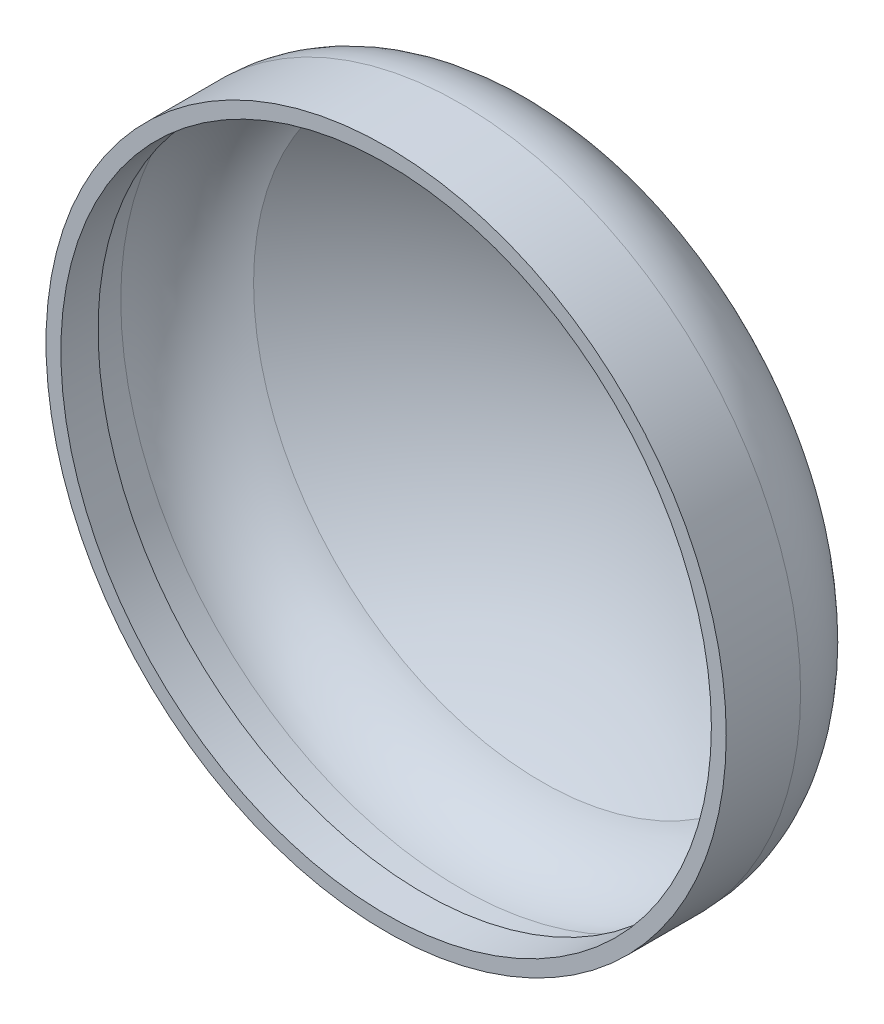
ISO-10303-21;
HEADER;
FILE_DESCRIPTION(('STEP AP214'),'2;1');
FILE_NAME('part.step','',(''),(''),'','','');
FILE_SCHEMA(('AUTOMOTIVE_DESIGN { 1 0 10303 214 1 1 1 1 }'));
ENDSEC;
DATA;
#1=APPLICATION_CONTEXT('core data for automotive mechanical design processes');
#2=APPLICATION_PROTOCOL_DEFINITION('international standard','automotive_design',2000,#1);
#3=PRODUCT_CONTEXT('',#1,'mechanical');
#4=PRODUCT('Part','Part','',(#3));
#5=PRODUCT_RELATED_PRODUCT_CATEGORY('part','',(#4));
#6=PRODUCT_DEFINITION_FORMATION('','',#4);
#7=PRODUCT_DEFINITION_CONTEXT('part definition',#1,'design');
#8=PRODUCT_DEFINITION('design','',#6,#7);
#9=PRODUCT_DEFINITION_SHAPE('','',#8);
#10=(LENGTH_UNIT() NAMED_UNIT(*) SI_UNIT(.MILLI.,.METRE.));
#11=(NAMED_UNIT(*) PLANE_ANGLE_UNIT() SI_UNIT($,.RADIAN.));
#12=(NAMED_UNIT(*) SI_UNIT($,.STERADIAN.) SOLID_ANGLE_UNIT());
#13=UNCERTAINTY_MEASURE_WITH_UNIT(LENGTH_MEASURE(1.E-05),#10,'distance_accuracy_value','');
#14=(GEOMETRIC_REPRESENTATION_CONTEXT(3) GLOBAL_UNCERTAINTY_ASSIGNED_CONTEXT((#13)) GLOBAL_UNIT_ASSIGNED_CONTEXT((#10,
#11,#12)) REPRESENTATION_CONTEXT('',''));
#15=CARTESIAN_POINT('',(0.,0.,0.));
#16=DIRECTION('',(0.,0.,1.));
#17=DIRECTION('',(1.,0.,0.));
#18=AXIS2_PLACEMENT_3D('',#15,#16,#17);
#19=CARTESIAN_POINT('',(0.,0.,50.8));
#20=DIRECTION('',(0.,0.,1.));
#21=DIRECTION('',(1.,0.,0.));
#22=AXIS2_PLACEMENT_3D('',#19,#20,#21);
#23=PLANE('',#22);
#24=CARTESIAN_POINT('',(0.,0.,50.8));
#25=DIRECTION('',(0.,0.,1.));
#26=DIRECTION('',(1.,0.,0.));
#27=AXIS2_PLACEMENT_3D('',#24,#25,#26);
#28=CIRCLE('',#27,464.82);
#29=CARTESIAN_POINT('',(464.82,0.,50.8));
#30=VERTEX_POINT('',#29);
#31=EDGE_CURVE('E11',#30,#30,#28,.T.);
#32=ORIENTED_EDGE('',*,*,#31,.T.);
#33=EDGE_LOOP('',(#32));
#34=FACE_BOUND('',#33,.T.);
#35=CARTESIAN_POINT('',(0.,0.,50.8));
#36=DIRECTION('',(0.,0.,1.));
#37=DIRECTION('',(1.,0.,0.));
#38=AXIS2_PLACEMENT_3D('',#35,#36,#37);
#39=CIRCLE('',#38,444.5);
#40=CARTESIAN_POINT('',(444.5,0.,50.8));
#41=VERTEX_POINT('',#40);
#42=EDGE_CURVE('E53',#41,#41,#39,.T.);
#43=ORIENTED_EDGE('',*,*,#42,.F.);
#44=EDGE_LOOP('',(#43));
#45=FACE_BOUND('',#44,.T.);
#46=ADVANCED_FACE('F45',(#34,#45),#23,.T.);
#47=CARTESIAN_POINT('',(0.,0.,50.8));
#48=DIRECTION('',(0.,0.,-1.));
#49=DIRECTION('',(-1.,0.,0.));
#50=AXIS2_PLACEMENT_3D('',#47,#48,#49);
#51=CYLINDRICAL_SURFACE('',#50,464.82);
#52=ORIENTED_EDGE('',*,*,#31,.F.);
#53=EDGE_LOOP('',(#52));
#54=FACE_BOUND('',#53,.T.);
#55=CARTESIAN_POINT('',(0.,0.,-50.8));
#56=DIRECTION('',(0.,0.,1.));
#57=DIRECTION('',(1.,0.,0.));
#58=AXIS2_PLACEMENT_3D('',#55,#56,#57);
#59=CIRCLE('',#58,464.82);
#60=CARTESIAN_POINT('',(464.82,0.,-50.8));
#61=VERTEX_POINT('',#60);
#62=EDGE_CURVE('E81',#61,#61,#59,.T.);
#63=ORIENTED_EDGE('',*,*,#62,.T.);
#64=EDGE_LOOP('',(#63));
#65=FACE_BOUND('',#64,.T.);
#66=ADVANCED_FACE('F47',(#54,#65),#51,.T.);
#67=CARTESIAN_POINT('',(0.,0.,50.8));
#68=DIRECTION('',(0.,0.,-1.));
#69=DIRECTION('',(-1.,0.,0.));
#70=AXIS2_PLACEMENT_3D('',#67,#68,#69);
#71=CYLINDRICAL_SURFACE('',#70,444.5);
#72=ORIENTED_EDGE('',*,*,#42,.T.);
#73=EDGE_LOOP('',(#72));
#74=FACE_BOUND('',#73,.T.);
#75=CARTESIAN_POINT('',(0.,0.,0.));
#76=DIRECTION('',(0.,0.,1.));
#77=DIRECTION('',(1.,0.,0.));
#78=AXIS2_PLACEMENT_3D('',#75,#76,#77);
#79=CIRCLE('',#78,444.5);
#80=CARTESIAN_POINT('',(444.5,0.,0.));
#81=VERTEX_POINT('',#80);
#82=EDGE_CURVE('E82',#81,#81,#79,.T.);
#83=ORIENTED_EDGE('',*,*,#82,.F.);
#84=EDGE_LOOP('',(#83));
#85=FACE_BOUND('',#84,.T.);
#86=ADVANCED_FACE('F119',(#74,#85),#71,.F.);
#87=CARTESIAN_POINT('',(0.,0.,-50.8));
#88=DIRECTION('',(0.,0.,1.));
#89=DIRECTION('',(1.,0.,0.));
#90=AXIS2_PLACEMENT_3D('',#87,#88,#89);
#91=TOROIDAL_SURFACE('',#90,342.012309747812,122.807690252189);
#92=CARTESIAN_POINT('',(0.,0.,-162.113606977205));
#93=DIRECTION('',(0.,0.,1.));
#94=DIRECTION('',(1.,0.,0.));
#95=AXIS2_PLACEMENT_3D('',#92,#93,#94);
#96=CIRCLE('',#95,393.887252512134);
#97=CARTESIAN_POINT('',(393.887252512134,0.,-162.113606977205));
#98=VERTEX_POINT('',#97);
#99=EDGE_CURVE('E78',#98,#98,#96,.T.);
#100=ORIENTED_EDGE('',*,*,#99,.T.);
#101=EDGE_LOOP('',(#100));
#102=FACE_BOUND('',#101,.T.);
#103=ORIENTED_EDGE('',*,*,#62,.F.);
#104=EDGE_LOOP('',(#103));
#105=FACE_BOUND('',#104,.T.);
#106=ADVANCED_FACE('F125',(#102,#105),#91,.T.);
#107=CARTESIAN_POINT('',(-49.5153130740444,0.,446.895628255073));
#108=DIRECTION('',(0.,-1.,0.));
#109=DIRECTION('',(1.,0.,0.));
#110=AXIS2_PLACEMENT_3D('',#107,#108,#109);
#111=CIRCLE('',#110,753.324686816123);
#112=TRIMMED_CURVE('',#111,(PARAMETER_VALUE(-1.505019860155)),(PARAMETER_VALUE(1.505019860155)),
.T.,.PARAMETER.);
#113=CARTESIAN_POINT('',(0.,0.,446.895628255073));
#114=DIRECTION('',(0.,0.,1.));
#115=AXIS1_PLACEMENT('',#113,#114);
#116=SURFACE_OF_REVOLUTION('',#112,#115);
#117=CARTESIAN_POINT('',(0.,0.,-304.8));
#118=VERTEX_POINT('',#117);
#119=VERTEX_LOOP('',#118);
#120=FACE_BOUND('',#119,.T.);
#121=ORIENTED_EDGE('',*,*,#99,.F.);
#122=EDGE_LOOP('',(#121));
#123=FACE_BOUND('',#122,.T.);
#124=ADVANCED_FACE('F129',(#120,#123),#116,.T.);
#125=CARTESIAN_POINT('',(0.,0.,50.2412));
#126=DIRECTION('',(0.,0.,1.));
#127=DIRECTION('',(1.,0.,0.));
#128=AXIS2_PLACEMENT_3D('',#125,#126,#127);
#129=PLANE('',#128);
#130=CARTESIAN_POINT('',(0.,0.,50.2412));
#131=DIRECTION('',(0.,0.,1.));
#132=DIRECTION('',(1.,0.,0.));
#133=AXIS2_PLACEMENT_3D('',#130,#131,#132);
#134=CIRCLE('',#133,464.2612);
#135=CARTESIAN_POINT('',(464.2612,0.,50.2412));
#136=VERTEX_POINT('',#135);
#137=EDGE_CURVE('E87',#136,#136,#134,.T.);
#138=ORIENTED_EDGE('',*,*,#137,.F.);
#139=EDGE_LOOP('',(#138));
#140=FACE_BOUND('',#139,.T.);
#141=CARTESIAN_POINT('',(0.,0.,50.2412));
#142=DIRECTION('',(0.,0.,1.));
#143=DIRECTION('',(1.,0.,0.));
#144=AXIS2_PLACEMENT_3D('',#141,#142,#143);
#145=CIRCLE('',#144,445.0588);
#146=CARTESIAN_POINT('',(445.0588,0.,50.2412));
#147=VERTEX_POINT('',#146);
#148=EDGE_CURVE('E77',#147,#147,#145,.T.);
#149=ORIENTED_EDGE('',*,*,#148,.T.);
#150=EDGE_LOOP('',(#149));
#151=FACE_BOUND('',#150,.T.);
#152=ADVANCED_FACE('F97',(#140,#151),#129,.F.);
#153=CARTESIAN_POINT('',(0.,0.,50.8));
#154=DIRECTION('',(0.,0.,-1.));
#155=DIRECTION('',(-1.,0.,0.));
#156=AXIS2_PLACEMENT_3D('',#153,#154,#155);
#157=CYLINDRICAL_SURFACE('',#156,464.2612);
#158=ORIENTED_EDGE('',*,*,#137,.T.);
#159=EDGE_LOOP('',(#158));
#160=FACE_BOUND('',#159,.T.);
#161=CARTESIAN_POINT('',(0.,0.,-50.8));
#162=DIRECTION('',(0.,0.,-1.));
#163=DIRECTION('',(-1.,0.,0.));
#164=AXIS2_PLACEMENT_3D('',#161,#162,#163);
#165=CIRCLE('',#164,464.2612);
#166=CARTESIAN_POINT('',(-464.2612,0.,-50.8));
#167=VERTEX_POINT('',#166);
#168=EDGE_CURVE('E68',#167,#167,#165,.F.);
#169=ORIENTED_EDGE('',*,*,#168,.F.);
#170=EDGE_LOOP('',(#169));
#171=FACE_BOUND('',#170,.T.);
#172=ADVANCED_FACE('F103',(#160,#171),#157,.F.);
#173=CARTESIAN_POINT('',(0.,0.,50.8));
#174=DIRECTION('',(0.,0.,-1.));
#175=DIRECTION('',(-1.,0.,0.));
#176=AXIS2_PLACEMENT_3D('',#173,#174,#175);
#177=CYLINDRICAL_SURFACE('',#176,445.0588);
#178=ORIENTED_EDGE('',*,*,#148,.F.);
#179=EDGE_LOOP('',(#178));
#180=FACE_BOUND('',#179,.T.);
#181=CARTESIAN_POINT('',(0.,0.,0.));
#182=DIRECTION('',(0.,0.,1.));
#183=DIRECTION('',(1.,0.,0.));
#184=AXIS2_PLACEMENT_3D('',#181,#182,#183);
#185=CIRCLE('',#184,445.0588);
#186=CARTESIAN_POINT('',(445.0588,0.,0.));
#187=VERTEX_POINT('',#186);
#188=EDGE_CURVE('E71',#187,#187,#185,.T.);
#189=ORIENTED_EDGE('',*,*,#188,.T.);
#190=EDGE_LOOP('',(#189));
#191=FACE_BOUND('',#190,.T.);
#192=ADVANCED_FACE('F99',(#180,#191),#177,.T.);
#193=CARTESIAN_POINT('',(0.,0.,0.));
#194=DIRECTION('',(0.,0.,1.));
#195=DIRECTION('',(1.,0.,0.));
#196=AXIS2_PLACEMENT_3D('',#193,#194,#195);
#197=PLANE('',#196);
#198=ORIENTED_EDGE('',*,*,#82,.T.);
#199=EDGE_LOOP('',(#198));
#200=FACE_BOUND('',#199,.T.);
#201=ORIENTED_EDGE('',*,*,#188,.F.);
#202=EDGE_LOOP('',(#201));
#203=FACE_BOUND('',#202,.T.);
#204=ADVANCED_FACE('F102',(#200,#203),#197,.F.);
#205=CARTESIAN_POINT('',(0.,0.,-50.8));
#206=DIRECTION('',(0.,0.,1.));
#207=DIRECTION('',(1.,0.,0.));
#208=AXIS2_PLACEMENT_3D('',#205,#206,#207);
#209=TOROIDAL_SURFACE('',#208,342.012309747812,122.248890252189);
#210=CARTESIAN_POINT('',(0.,0.,-161.629950012309));
#211=DIRECTION('',(0.,0.,1.));
#212=DIRECTION('',(1.,0.,0.));
#213=AXIS2_PLACEMENT_3D('',#210,#211,#212);
#214=CIRCLE('',#213,393.602166775727);
#215=CARTESIAN_POINT('',(393.602166775727,0.,-161.629950012309));
#216=VERTEX_POINT('',#215);
#217=EDGE_CURVE('E66',#216,#216,#214,.T.);
#218=ORIENTED_EDGE('',*,*,#217,.F.);
#219=EDGE_LOOP('',(#218));
#220=FACE_BOUND('',#219,.T.);
#221=ORIENTED_EDGE('',*,*,#168,.T.);
#222=EDGE_LOOP('',(#221));
#223=FACE_BOUND('',#222,.T.);
#224=ADVANCED_FACE('F62',(#220,#223),#209,.F.);
#225=CARTESIAN_POINT('',(-49.5153130740444,0.,446.895628255073));
#226=DIRECTION('',(0.,-1.,0.));
#227=DIRECTION('',(1.,0.,0.));
#228=AXIS2_PLACEMENT_3D('',#225,#226,#227);
#229=CIRCLE('',#228,752.765886816123);
#230=TRIMMED_CURVE('',#229,(PARAMETER_VALUE(-1.50497096175238)),
(PARAMETER_VALUE(1.50497096175238)),.T.,.PARAMETER.);
#231=CARTESIAN_POINT('',(0.,0.,446.895628255073));
#232=DIRECTION('',(0.,0.,1.));
#233=AXIS1_PLACEMENT('',#231,#232);
#234=SURFACE_OF_REVOLUTION('',#230,#233);
#235=CARTESIAN_POINT('',(0.,0.,-304.239988078784));
#236=VERTEX_POINT('',#235);
#237=VERTEX_LOOP('',#236);
#238=FACE_BOUND('',#237,.T.);
#239=ORIENTED_EDGE('',*,*,#217,.T.);
#240=EDGE_LOOP('',(#239));
#241=FACE_BOUND('',#240,.T.);
#242=ADVANCED_FACE('F59',(#238,#241),#234,.F.);
#243=CLOSED_SHELL('',(#46,#66,#86,#106,#124,#152,#172,#192,#204,#224,#242));
#244=MANIFOLD_SOLID_BREP('B2',#243);
#245=ADVANCED_BREP_SHAPE_REPRESENTATION('',(#18,#244),#14);
#246=SHAPE_DEFINITION_REPRESENTATION(#9,#245);
ENDSEC;
END-ISO-10303-21;
